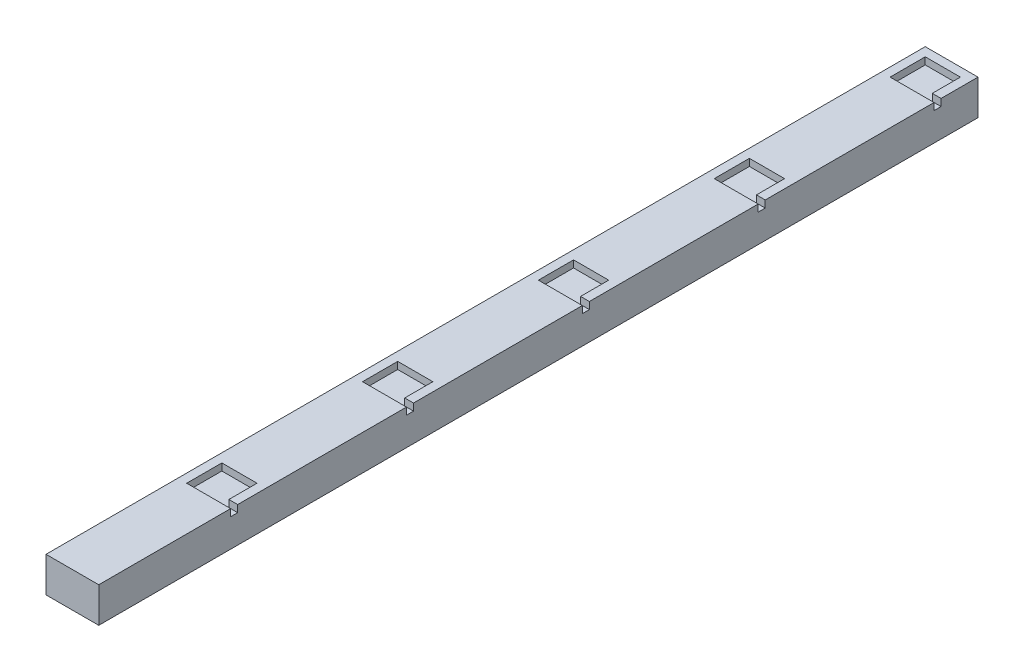
ISO-10303-21;
HEADER;
FILE_DESCRIPTION(('STEP AP214'),'2;1');
FILE_NAME('part.step','',(''),(''),'','','');
FILE_SCHEMA(('AUTOMOTIVE_DESIGN { 1 0 10303 214 1 1 1 1 }'));
ENDSEC;
DATA;
#1=APPLICATION_CONTEXT('core data for automotive mechanical design processes');
#2=APPLICATION_PROTOCOL_DEFINITION('international standard','automotive_design',2000,#1);
#3=PRODUCT_CONTEXT('',#1,'mechanical');
#4=PRODUCT('Part','Part','',(#3));
#5=PRODUCT_RELATED_PRODUCT_CATEGORY('part','',(#4));
#6=PRODUCT_DEFINITION_FORMATION('','',#4);
#7=PRODUCT_DEFINITION_CONTEXT('part definition',#1,'design');
#8=PRODUCT_DEFINITION('design','',#6,#7);
#9=PRODUCT_DEFINITION_SHAPE('','',#8);
#10=(LENGTH_UNIT() NAMED_UNIT(*) SI_UNIT(.MILLI.,.METRE.));
#11=(NAMED_UNIT(*) PLANE_ANGLE_UNIT() SI_UNIT($,.RADIAN.));
#12=(NAMED_UNIT(*) SI_UNIT($,.STERADIAN.) SOLID_ANGLE_UNIT());
#13=UNCERTAINTY_MEASURE_WITH_UNIT(LENGTH_MEASURE(1.E-05),#10,'distance_accuracy_value','');
#14=(GEOMETRIC_REPRESENTATION_CONTEXT(3) GLOBAL_UNCERTAINTY_ASSIGNED_CONTEXT((#13)) GLOBAL_UNIT_ASSIGNED_CONTEXT((#10,
#11,#12)) REPRESENTATION_CONTEXT('',''));
#15=CARTESIAN_POINT('',(0.,0.,0.));
#16=DIRECTION('',(0.,0.,1.));
#17=DIRECTION('',(1.,0.,0.));
#18=AXIS2_PLACEMENT_3D('',#15,#16,#17);
#19=CARTESIAN_POINT('',(0.,10.,-300.));
#20=DIRECTION('',(1.,0.,0.));
#21=DIRECTION('',(0.,0.,-1.));
#22=AXIS2_PLACEMENT_3D('',#19,#20,#21);
#23=PLANE('',#22);
#24=DIRECTION('',(0.,-1.,0.));
#25=VECTOR('',#24,1.);
#26=CARTESIAN_POINT('',(0.,10.,-50.));
#27=LINE('',#26,#25);
#28=CARTESIAN_POINT('',(0.,10.,-50.));
#29=VERTEX_POINT('',#28);
#30=CARTESIAN_POINT('',(0.,0.,-50.));
#31=VERTEX_POINT('',#30);
#32=EDGE_CURVE('E52',#29,#31,#27,.T.);
#33=ORIENTED_EDGE('',*,*,#32,.F.);
#34=DIRECTION('',(0.,0.,1.));
#35=VECTOR('',#34,1.);
#36=CARTESIAN_POINT('',(0.,10.,-300.));
#37=LINE('',#36,#35);
#38=CARTESIAN_POINT('',(0.,10.,-300.));
#39=VERTEX_POINT('',#38);
#40=EDGE_CURVE('E278',#39,#29,#37,.T.);
#41=ORIENTED_EDGE('',*,*,#40,.F.);
#42=DIRECTION('',(0.,-1.,0.));
#43=VECTOR('',#42,1.);
#44=CARTESIAN_POINT('',(0.,10.,-300.));
#45=LINE('',#44,#43);
#46=CARTESIAN_POINT('',(0.,0.,-300.));
#47=VERTEX_POINT('',#46);
#48=EDGE_CURVE('E46',#39,#47,#45,.T.);
#49=ORIENTED_EDGE('',*,*,#48,.T.);
#50=DIRECTION('',(0.,0.,1.));
#51=VECTOR('',#50,1.);
#52=CARTESIAN_POINT('',(0.,0.,-300.));
#53=LINE('',#52,#51);
#54=EDGE_CURVE('E279',#47,#31,#53,.T.);
#55=ORIENTED_EDGE('',*,*,#54,.T.);
#56=EDGE_LOOP('',(#33,#41,#49,#55));
#57=FACE_BOUND('',#56,.T.);
#58=ADVANCED_FACE('F39',(#57),#23,.F.);
#59=CARTESIAN_POINT('',(15.,10.,-300.));
#60=DIRECTION('',(-1.,0.,0.));
#61=DIRECTION('',(0.,0.,1.));
#62=AXIS2_PLACEMENT_3D('',#59,#60,#61);
#63=PLANE('',#62);
#64=DIRECTION('',(0.,1.,0.));
#65=VECTOR('',#64,1.);
#66=CARTESIAN_POINT('',(15.,10.,-50.));
#67=LINE('',#66,#65);
#68=CARTESIAN_POINT('',(15.,0.,-50.));
#69=VERTEX_POINT('',#68);
#70=CARTESIAN_POINT('',(15.,10.,-50.));
#71=VERTEX_POINT('',#70);
#72=EDGE_CURVE('E259',#69,#71,#67,.T.);
#73=ORIENTED_EDGE('',*,*,#72,.F.);
#74=DIRECTION('',(0.,0.,-1.));
#75=VECTOR('',#74,1.);
#76=CARTESIAN_POINT('',(15.,0.,-300.));
#77=LINE('',#76,#75);
#78=CARTESIAN_POINT('',(15.,0.,-300.));
#79=VERTEX_POINT('',#78);
#80=EDGE_CURVE('E269',#69,#79,#77,.T.);
#81=ORIENTED_EDGE('',*,*,#80,.T.);
#82=DIRECTION('',(0.,-1.,0.));
#83=VECTOR('',#82,1.);
#84=CARTESIAN_POINT('',(15.,10.,-300.));
#85=LINE('',#84,#83);
#86=CARTESIAN_POINT('',(15.,10.,-300.));
#87=VERTEX_POINT('',#86);
#88=EDGE_CURVE('E11',#87,#79,#85,.T.);
#89=ORIENTED_EDGE('',*,*,#88,.F.);
#90=DIRECTION('',(0.,0.,-1.));
#91=VECTOR('',#90,1.);
#92=CARTESIAN_POINT('',(15.,10.,-300.));
#93=LINE('',#92,#91);
#94=CARTESIAN_POINT('',(15.,10.,-289.5));
#95=VERTEX_POINT('',#94);
#96=EDGE_CURVE('E293',#95,#87,#93,.T.);
#97=ORIENTED_EDGE('',*,*,#96,.F.);
#98=DIRECTION('',(0.,1.,0.));
#99=VECTOR('',#98,1.);
#100=CARTESIAN_POINT('',(15.,8.,-289.5));
#101=LINE('',#100,#99);
#102=CARTESIAN_POINT('',(15.,8.,-289.5));
#103=VERTEX_POINT('',#102);
#104=EDGE_CURVE('E301',#103,#95,#101,.T.);
#105=ORIENTED_EDGE('',*,*,#104,.F.);
#106=DIRECTION('',(0.,0.,-1.));
#107=VECTOR('',#106,1.);
#108=CARTESIAN_POINT('',(15.,8.,-287.5));
#109=LINE('',#108,#107);
#110=CARTESIAN_POINT('',(15.,8.,-287.5));
#111=VERTEX_POINT('',#110);
#112=EDGE_CURVE('E336',#111,#103,#109,.T.);
#113=ORIENTED_EDGE('',*,*,#112,.F.);
#114=DIRECTION('',(0.,1.,0.));
#115=VECTOR('',#114,1.);
#116=CARTESIAN_POINT('',(15.,8.,-287.5));
#117=LINE('',#116,#115);
#118=CARTESIAN_POINT('',(15.,10.,-287.5));
#119=VERTEX_POINT('',#118);
#120=EDGE_CURVE('E299',#111,#119,#117,.T.);
#121=ORIENTED_EDGE('',*,*,#120,.T.);
#122=CARTESIAN_POINT('',(15.,10.,-239.5));
#123=VERTEX_POINT('',#122);
#124=EDGE_CURVE('E693',#123,#119,#93,.T.);
#125=ORIENTED_EDGE('',*,*,#124,.F.);
#126=DIRECTION('',(0.,1.,0.));
#127=VECTOR('',#126,1.);
#128=CARTESIAN_POINT('',(15.,8.,-239.5));
#129=LINE('',#128,#127);
#130=CARTESIAN_POINT('',(15.,8.,-239.5));
#131=VERTEX_POINT('',#130);
#132=EDGE_CURVE('E349',#131,#123,#129,.T.);
#133=ORIENTED_EDGE('',*,*,#132,.F.);
#134=DIRECTION('',(0.,0.,-1.));
#135=VECTOR('',#134,1.);
#136=CARTESIAN_POINT('',(15.,8.,-237.5));
#137=LINE('',#136,#135);
#138=CARTESIAN_POINT('',(15.,8.,-237.5));
#139=VERTEX_POINT('',#138);
#140=EDGE_CURVE('E381',#139,#131,#137,.T.);
#141=ORIENTED_EDGE('',*,*,#140,.F.);
#142=DIRECTION('',(0.,1.,0.));
#143=VECTOR('',#142,1.);
#144=CARTESIAN_POINT('',(15.,8.,-237.5));
#145=LINE('',#144,#143);
#146=CARTESIAN_POINT('',(15.,10.,-237.5));
#147=VERTEX_POINT('',#146);
#148=EDGE_CURVE('E343',#139,#147,#145,.T.);
#149=ORIENTED_EDGE('',*,*,#148,.T.);
#150=CARTESIAN_POINT('',(15.,10.,-189.5));
#151=VERTEX_POINT('',#150);
#152=EDGE_CURVE('E697',#151,#147,#93,.T.);
#153=ORIENTED_EDGE('',*,*,#152,.F.);
#154=DIRECTION('',(0.,1.,0.));
#155=VECTOR('',#154,1.);
#156=CARTESIAN_POINT('',(15.,8.,-189.5));
#157=LINE('',#156,#155);
#158=CARTESIAN_POINT('',(15.,8.,-189.5));
#159=VERTEX_POINT('',#158);
#160=EDGE_CURVE('E393',#159,#151,#157,.T.);
#161=ORIENTED_EDGE('',*,*,#160,.F.);
#162=DIRECTION('',(0.,0.,-1.));
#163=VECTOR('',#162,1.);
#164=CARTESIAN_POINT('',(15.,8.,-189.5));
#165=LINE('',#164,#163);
#166=CARTESIAN_POINT('',(15.,8.,-187.5));
#167=VERTEX_POINT('',#166);
#168=EDGE_CURVE('E426',#167,#159,#165,.T.);
#169=ORIENTED_EDGE('',*,*,#168,.F.);
#170=DIRECTION('',(0.,1.,0.));
#171=VECTOR('',#170,1.);
#172=CARTESIAN_POINT('',(15.,8.,-187.5));
#173=LINE('',#172,#171);
#174=CARTESIAN_POINT('',(15.,10.,-187.5));
#175=VERTEX_POINT('',#174);
#176=EDGE_CURVE('E388',#167,#175,#173,.T.);
#177=ORIENTED_EDGE('',*,*,#176,.T.);
#178=CARTESIAN_POINT('',(15.,10.,-139.5));
#179=VERTEX_POINT('',#178);
#180=EDGE_CURVE('E705',#179,#175,#93,.T.);
#181=ORIENTED_EDGE('',*,*,#180,.F.);
#182=DIRECTION('',(0.,1.,0.));
#183=VECTOR('',#182,1.);
#184=CARTESIAN_POINT('',(15.,8.,-139.5));
#185=LINE('',#184,#183);
#186=CARTESIAN_POINT('',(15.,8.,-139.5));
#187=VERTEX_POINT('',#186);
#188=EDGE_CURVE('E438',#187,#179,#185,.T.);
#189=ORIENTED_EDGE('',*,*,#188,.F.);
#190=DIRECTION('',(0.,0.,-1.));
#191=VECTOR('',#190,1.);
#192=CARTESIAN_POINT('',(15.,8.,-139.5));
#193=LINE('',#192,#191);
#194=CARTESIAN_POINT('',(15.,8.,-137.5));
#195=VERTEX_POINT('',#194);
#196=EDGE_CURVE('E473',#195,#187,#193,.T.);
#197=ORIENTED_EDGE('',*,*,#196,.F.);
#198=DIRECTION('',(0.,1.,0.));
#199=VECTOR('',#198,1.);
#200=CARTESIAN_POINT('',(15.,8.,-137.5));
#201=LINE('',#200,#199);
#202=CARTESIAN_POINT('',(15.,10.,-137.5));
#203=VERTEX_POINT('',#202);
#204=EDGE_CURVE('E434',#195,#203,#201,.T.);
#205=ORIENTED_EDGE('',*,*,#204,.T.);
#206=CARTESIAN_POINT('',(15.,10.,-89.5));
#207=VERTEX_POINT('',#206);
#208=EDGE_CURVE('E291',#207,#203,#93,.T.);
#209=ORIENTED_EDGE('',*,*,#208,.F.);
#210=DIRECTION('',(0.,1.,0.));
#211=VECTOR('',#210,1.);
#212=CARTESIAN_POINT('',(15.,8.,-89.5));
#213=LINE('',#212,#211);
#214=CARTESIAN_POINT('',(15.,8.,-89.5));
#215=VERTEX_POINT('',#214);
#216=EDGE_CURVE('E483',#215,#207,#213,.T.);
#217=ORIENTED_EDGE('',*,*,#216,.F.);
#218=DIRECTION('',(0.,0.,-1.));
#219=VECTOR('',#218,1.);
#220=CARTESIAN_POINT('',(15.,8.,-89.5));
#221=LINE('',#220,#219);
#222=CARTESIAN_POINT('',(15.,8.,-87.5));
#223=VERTEX_POINT('',#222);
#224=EDGE_CURVE('E515',#223,#215,#221,.T.);
#225=ORIENTED_EDGE('',*,*,#224,.F.);
#226=DIRECTION('',(0.,1.,0.));
#227=VECTOR('',#226,1.);
#228=CARTESIAN_POINT('',(15.,8.,-87.5));
#229=LINE('',#228,#227);
#230=CARTESIAN_POINT('',(15.,10.,-87.5));
#231=VERTEX_POINT('',#230);
#232=EDGE_CURVE('E477',#223,#231,#229,.T.);
#233=ORIENTED_EDGE('',*,*,#232,.T.);
#234=EDGE_CURVE('E275',#71,#231,#93,.T.);
#235=ORIENTED_EDGE('',*,*,#234,.F.);
#236=EDGE_LOOP('',(#73,#81,#89,#97,#105,#113,#121,#125,#133,#141,#149,#153,#161,#169,#177,#181,
#189,#197,#205,#209,#217,#225,#233,#235));
#237=FACE_BOUND('',#236,.T.);
#238=ADVANCED_FACE('F268',(#237),#63,.F.);
#239=CARTESIAN_POINT('',(0.,0.,0.));
#240=DIRECTION('',(0.,1.,0.));
#241=DIRECTION('',(0.,0.,1.));
#242=AXIS2_PLACEMENT_3D('',#239,#240,#241);
#243=PLANE('',#242);
#244=DIRECTION('',(1.,0.,0.));
#245=VECTOR('',#244,1.);
#246=CARTESIAN_POINT('',(0.,0.,-50.));
#247=LINE('',#246,#245);
#248=EDGE_CURVE('E258',#31,#69,#247,.T.);
#249=ORIENTED_EDGE('',*,*,#248,.F.);
#250=ORIENTED_EDGE('',*,*,#54,.F.);
#251=DIRECTION('',(-1.,0.,0.));
#252=VECTOR('',#251,1.);
#253=CARTESIAN_POINT('',(0.,0.,-300.));
#254=LINE('',#253,#252);
#255=EDGE_CURVE('E280',#79,#47,#254,.T.);
#256=ORIENTED_EDGE('',*,*,#255,.F.);
#257=ORIENTED_EDGE('',*,*,#80,.F.);
#258=EDGE_LOOP('',(#249,#250,#256,#257));
#259=FACE_BOUND('',#258,.T.);
#260=ADVANCED_FACE('F277',(#259),#243,.F.);
#261=CARTESIAN_POINT('',(0.,10.,-300.));
#262=DIRECTION('',(0.,0.,1.));
#263=DIRECTION('',(1.,0.,0.));
#264=AXIS2_PLACEMENT_3D('',#261,#262,#263);
#265=PLANE('',#264);
#266=ORIENTED_EDGE('',*,*,#255,.T.);
#267=ORIENTED_EDGE('',*,*,#48,.F.);
#268=DIRECTION('',(-1.,0.,0.));
#269=VECTOR('',#268,1.);
#270=CARTESIAN_POINT('',(0.,10.,-300.));
#271=LINE('',#270,#269);
#272=EDGE_CURVE('E287',#87,#39,#271,.T.);
#273=ORIENTED_EDGE('',*,*,#272,.F.);
#274=ORIENTED_EDGE('',*,*,#88,.T.);
#275=EDGE_LOOP('',(#266,#267,#273,#274));
#276=FACE_BOUND('',#275,.T.);
#277=ADVANCED_FACE('F524',(#276),#265,.F.);
#278=CARTESIAN_POINT('',(0.,10.,0.));
#279=DIRECTION('',(0.,1.,0.));
#280=DIRECTION('',(0.,0.,1.));
#281=AXIS2_PLACEMENT_3D('',#278,#279,#280);
#282=PLANE('',#281);
#283=DIRECTION('',(-1.,0.,0.));
#284=VECTOR('',#283,1.);
#285=CARTESIAN_POINT('',(0.,10.,-50.));
#286=LINE('',#285,#284);
#287=EDGE_CURVE('E272',#71,#29,#286,.T.);
#288=ORIENTED_EDGE('',*,*,#287,.F.);
#289=ORIENTED_EDGE('',*,*,#234,.T.);
#290=DIRECTION('',(1.,0.,0.));
#291=VECTOR('',#290,1.);
#292=CARTESIAN_POINT('',(12.5,10.,-87.5));
#293=LINE('',#292,#291);
#294=CARTESIAN_POINT('',(2.5,10.,-87.5));
#295=VERTEX_POINT('',#294);
#296=EDGE_CURVE('E499',#295,#231,#293,.T.);
#297=ORIENTED_EDGE('',*,*,#296,.F.);
#298=DIRECTION('',(0.,0.,1.));
#299=VECTOR('',#298,1.);
#300=CARTESIAN_POINT('',(2.5,10.,-97.5));
#301=LINE('',#300,#299);
#302=CARTESIAN_POINT('',(2.5,10.,-97.5));
#303=VERTEX_POINT('',#302);
#304=EDGE_CURVE('E501',#303,#295,#301,.T.);
#305=ORIENTED_EDGE('',*,*,#304,.F.);
#306=DIRECTION('',(-1.,0.,0.));
#307=VECTOR('',#306,1.);
#308=CARTESIAN_POINT('',(2.5,10.,-97.5));
#309=LINE('',#308,#307);
#310=CARTESIAN_POINT('',(12.5,10.,-97.5));
#311=VERTEX_POINT('',#310);
#312=EDGE_CURVE('E489',#311,#303,#309,.T.);
#313=ORIENTED_EDGE('',*,*,#312,.F.);
#314=DIRECTION('',(0.,0.,-1.));
#315=VECTOR('',#314,1.);
#316=CARTESIAN_POINT('',(12.5,10.,-89.5));
#317=LINE('',#316,#315);
#318=CARTESIAN_POINT('',(12.5,10.,-89.5));
#319=VERTEX_POINT('',#318);
#320=EDGE_CURVE('E493',#319,#311,#317,.T.);
#321=ORIENTED_EDGE('',*,*,#320,.F.);
#322=DIRECTION('',(-1.,0.,0.));
#323=VECTOR('',#322,1.);
#324=CARTESIAN_POINT('',(12.5,10.,-89.5));
#325=LINE('',#324,#323);
#326=EDGE_CURVE('E61',#207,#319,#325,.T.);
#327=ORIENTED_EDGE('',*,*,#326,.F.);
#328=ORIENTED_EDGE('',*,*,#208,.T.);
#329=DIRECTION('',(1.,0.,0.));
#330=VECTOR('',#329,1.);
#331=CARTESIAN_POINT('',(12.5,10.,-137.5));
#332=LINE('',#331,#330);
#333=CARTESIAN_POINT('',(2.5,10.,-137.5));
#334=VERTEX_POINT('',#333);
#335=EDGE_CURVE('E457',#334,#203,#332,.T.);
#336=ORIENTED_EDGE('',*,*,#335,.F.);
#337=DIRECTION('',(0.,0.,1.));
#338=VECTOR('',#337,1.);
#339=CARTESIAN_POINT('',(2.5,10.,-147.5));
#340=LINE('',#339,#338);
#341=CARTESIAN_POINT('',(2.5,10.,-147.5));
#342=VERTEX_POINT('',#341);
#343=EDGE_CURVE('E459',#342,#334,#340,.T.);
#344=ORIENTED_EDGE('',*,*,#343,.F.);
#345=DIRECTION('',(-1.,0.,0.));
#346=VECTOR('',#345,1.);
#347=CARTESIAN_POINT('',(2.5,10.,-147.5));
#348=LINE('',#347,#346);
#349=CARTESIAN_POINT('',(12.5,10.,-147.5));
#350=VERTEX_POINT('',#349);
#351=EDGE_CURVE('E450',#350,#342,#348,.T.);
#352=ORIENTED_EDGE('',*,*,#351,.F.);
#353=DIRECTION('',(0.,0.,-1.));
#354=VECTOR('',#353,1.);
#355=CARTESIAN_POINT('',(12.5,10.,-139.5));
#356=LINE('',#355,#354);
#357=CARTESIAN_POINT('',(12.5,10.,-139.5));
#358=VERTEX_POINT('',#357);
#359=EDGE_CURVE('E452',#358,#350,#356,.T.);
#360=ORIENTED_EDGE('',*,*,#359,.F.);
#361=DIRECTION('',(-1.,0.,0.));
#362=VECTOR('',#361,1.);
#363=CARTESIAN_POINT('',(12.5,10.,-139.5));
#364=LINE('',#363,#362);
#365=EDGE_CURVE('E451',#179,#358,#364,.T.);
#366=ORIENTED_EDGE('',*,*,#365,.F.);
#367=ORIENTED_EDGE('',*,*,#180,.T.);
#368=DIRECTION('',(1.,0.,0.));
#369=VECTOR('',#368,1.);
#370=CARTESIAN_POINT('',(12.5,10.,-187.5));
#371=LINE('',#370,#369);
#372=CARTESIAN_POINT('',(2.5,10.,-187.5));
#373=VERTEX_POINT('',#372);
#374=EDGE_CURVE('E412',#373,#175,#371,.T.);
#375=ORIENTED_EDGE('',*,*,#374,.F.);
#376=DIRECTION('',(0.,0.,1.));
#377=VECTOR('',#376,1.);
#378=CARTESIAN_POINT('',(2.5,10.,-197.5));
#379=LINE('',#378,#377);
#380=CARTESIAN_POINT('',(2.5,10.,-197.5));
#381=VERTEX_POINT('',#380);
#382=EDGE_CURVE('E411',#381,#373,#379,.T.);
#383=ORIENTED_EDGE('',*,*,#382,.F.);
#384=DIRECTION('',(-1.,0.,0.));
#385=VECTOR('',#384,1.);
#386=CARTESIAN_POINT('',(2.5,10.,-197.5));
#387=LINE('',#386,#385);
#388=CARTESIAN_POINT('',(12.5,10.,-197.5));
#389=VERTEX_POINT('',#388);
#390=EDGE_CURVE('E405',#389,#381,#387,.T.);
#391=ORIENTED_EDGE('',*,*,#390,.F.);
#392=DIRECTION('',(0.,0.,-1.));
#393=VECTOR('',#392,1.);
#394=CARTESIAN_POINT('',(12.5,10.,-197.5));
#395=LINE('',#394,#393);
#396=CARTESIAN_POINT('',(12.5,10.,-189.5));
#397=VERTEX_POINT('',#396);
#398=EDGE_CURVE('E406',#397,#389,#395,.T.);
#399=ORIENTED_EDGE('',*,*,#398,.F.);
#400=DIRECTION('',(-1.,0.,0.));
#401=VECTOR('',#400,1.);
#402=CARTESIAN_POINT('',(12.5,10.,-189.5));
#403=LINE('',#402,#401);
#404=EDGE_CURVE('E408',#151,#397,#403,.T.);
#405=ORIENTED_EDGE('',*,*,#404,.F.);
#406=ORIENTED_EDGE('',*,*,#152,.T.);
#407=DIRECTION('',(1.,0.,0.));
#408=VECTOR('',#407,1.);
#409=CARTESIAN_POINT('',(12.5,10.,-237.5));
#410=LINE('',#409,#408);
#411=CARTESIAN_POINT('',(2.5,10.,-237.5));
#412=VERTEX_POINT('',#411);
#413=EDGE_CURVE('E368',#412,#147,#410,.T.);
#414=ORIENTED_EDGE('',*,*,#413,.F.);
#415=DIRECTION('',(0.,0.,1.));
#416=VECTOR('',#415,1.);
#417=CARTESIAN_POINT('',(2.5,10.,-247.5));
#418=LINE('',#417,#416);
#419=CARTESIAN_POINT('',(2.5,10.,-247.5));
#420=VERTEX_POINT('',#419);
#421=EDGE_CURVE('E369',#420,#412,#418,.T.);
#422=ORIENTED_EDGE('',*,*,#421,.F.);
#423=DIRECTION('',(-1.,0.,0.));
#424=VECTOR('',#423,1.);
#425=CARTESIAN_POINT('',(2.5,10.,-247.5));
#426=LINE('',#425,#424);
#427=CARTESIAN_POINT('',(12.5,10.,-247.5));
#428=VERTEX_POINT('',#427);
#429=EDGE_CURVE('E360',#428,#420,#426,.T.);
#430=ORIENTED_EDGE('',*,*,#429,.F.);
#431=DIRECTION('',(0.,0.,-1.));
#432=VECTOR('',#431,1.);
#433=CARTESIAN_POINT('',(12.5,10.,-247.5));
#434=LINE('',#433,#432);
#435=CARTESIAN_POINT('',(12.5,10.,-239.5));
#436=VERTEX_POINT('',#435);
#437=EDGE_CURVE('E363',#436,#428,#434,.T.);
#438=ORIENTED_EDGE('',*,*,#437,.F.);
#439=DIRECTION('',(-1.,0.,0.));
#440=VECTOR('',#439,1.);
#441=CARTESIAN_POINT('',(12.5,10.,-239.5));
#442=LINE('',#441,#440);
#443=EDGE_CURVE('E365',#123,#436,#442,.T.);
#444=ORIENTED_EDGE('',*,*,#443,.F.);
#445=ORIENTED_EDGE('',*,*,#124,.T.);
#446=DIRECTION('',(1.,0.,0.));
#447=VECTOR('',#446,1.);
#448=CARTESIAN_POINT('',(12.5,10.,-287.5));
#449=LINE('',#448,#447);
#450=CARTESIAN_POINT('',(2.5,10.,-287.5));
#451=VERTEX_POINT('',#450);
#452=EDGE_CURVE('E321',#451,#119,#449,.T.);
#453=ORIENTED_EDGE('',*,*,#452,.F.);
#454=DIRECTION('',(0.,0.,1.));
#455=VECTOR('',#454,1.);
#456=CARTESIAN_POINT('',(2.5,10.,-297.5));
#457=LINE('',#456,#455);
#458=CARTESIAN_POINT('',(2.5,10.,-297.5));
#459=VERTEX_POINT('',#458);
#460=EDGE_CURVE('E322',#459,#451,#457,.T.);
#461=ORIENTED_EDGE('',*,*,#460,.F.);
#462=DIRECTION('',(-1.,0.,0.));
#463=VECTOR('',#462,1.);
#464=CARTESIAN_POINT('',(2.5,10.,-297.5));
#465=LINE('',#464,#463);
#466=CARTESIAN_POINT('',(12.5,10.,-297.5));
#467=VERTEX_POINT('',#466);
#468=EDGE_CURVE('E315',#467,#459,#465,.T.);
#469=ORIENTED_EDGE('',*,*,#468,.F.);
#470=DIRECTION('',(0.,0.,-1.));
#471=VECTOR('',#470,1.);
#472=CARTESIAN_POINT('',(12.5,10.,-297.5));
#473=LINE('',#472,#471);
#474=CARTESIAN_POINT('',(12.5,10.,-289.5));
#475=VERTEX_POINT('',#474);
#476=EDGE_CURVE('E316',#475,#467,#473,.T.);
#477=ORIENTED_EDGE('',*,*,#476,.F.);
#478=DIRECTION('',(-1.,0.,0.));
#479=VECTOR('',#478,1.);
#480=CARTESIAN_POINT('',(12.5,10.,-289.5));
#481=LINE('',#480,#479);
#482=EDGE_CURVE('E317',#95,#475,#481,.T.);
#483=ORIENTED_EDGE('',*,*,#482,.F.);
#484=ORIENTED_EDGE('',*,*,#96,.T.);
#485=ORIENTED_EDGE('',*,*,#272,.T.);
#486=ORIENTED_EDGE('',*,*,#40,.T.);
#487=EDGE_LOOP('',(#288,#289,#297,#305,#313,#321,#327,#328,#336,#344,#352,#360,#366,#367,#375,
#383,#391,#399,#405,#406,#414,#422,#430,#438,#444,#445,#453,#461,#469,#477,#483,#484,#485,#486));
#488=FACE_BOUND('',#487,.T.);
#489=ADVANCED_FACE('F519',(#488),#282,.T.);
#490=CARTESIAN_POINT('',(2.5,8.,-297.5));
#491=DIRECTION('',(-1.,0.,0.));
#492=DIRECTION('',(0.,0.,1.));
#493=AXIS2_PLACEMENT_3D('',#490,#491,#492);
#494=PLANE('',#493);
#495=ORIENTED_EDGE('',*,*,#460,.T.);
#496=DIRECTION('',(0.,1.,0.));
#497=VECTOR('',#496,1.);
#498=CARTESIAN_POINT('',(2.5,8.,-287.5));
#499=LINE('',#498,#497);
#500=CARTESIAN_POINT('',(2.5,8.,-287.5));
#501=VERTEX_POINT('',#500);
#502=EDGE_CURVE('E297',#501,#451,#499,.T.);
#503=ORIENTED_EDGE('',*,*,#502,.F.);
#504=DIRECTION('',(0.,0.,1.));
#505=VECTOR('',#504,1.);
#506=CARTESIAN_POINT('',(2.5,8.,-297.5));
#507=LINE('',#506,#505);
#508=CARTESIAN_POINT('',(2.5,8.,-297.5));
#509=VERTEX_POINT('',#508);
#510=EDGE_CURVE('E312',#509,#501,#507,.T.);
#511=ORIENTED_EDGE('',*,*,#510,.F.);
#512=DIRECTION('',(0.,1.,0.));
#513=VECTOR('',#512,1.);
#514=CARTESIAN_POINT('',(2.5,8.,-297.5));
#515=LINE('',#514,#513);
#516=EDGE_CURVE('E285',#509,#459,#515,.T.);
#517=ORIENTED_EDGE('',*,*,#516,.T.);
#518=EDGE_LOOP('',(#495,#503,#511,#517));
#519=FACE_BOUND('',#518,.T.);
#520=ADVANCED_FACE('F525',(#519),#494,.F.);
#521=CARTESIAN_POINT('',(2.5,8.,-297.5));
#522=DIRECTION('',(0.,0.,-1.));
#523=DIRECTION('',(-1.,0.,0.));
#524=AXIS2_PLACEMENT_3D('',#521,#522,#523);
#525=PLANE('',#524);
#526=ORIENTED_EDGE('',*,*,#468,.T.);
#527=ORIENTED_EDGE('',*,*,#516,.F.);
#528=DIRECTION('',(-1.,0.,0.));
#529=VECTOR('',#528,1.);
#530=CARTESIAN_POINT('',(2.5,8.,-297.5));
#531=LINE('',#530,#529);
#532=CARTESIAN_POINT('',(12.5,8.,-297.5));
#533=VERTEX_POINT('',#532);
#534=EDGE_CURVE('E302',#533,#509,#531,.T.);
#535=ORIENTED_EDGE('',*,*,#534,.F.);
#536=DIRECTION('',(0.,1.,0.));
#537=VECTOR('',#536,1.);
#538=CARTESIAN_POINT('',(12.5,8.,-297.5));
#539=LINE('',#538,#537);
#540=EDGE_CURVE('E310',#533,#467,#539,.T.);
#541=ORIENTED_EDGE('',*,*,#540,.T.);
#542=EDGE_LOOP('',(#526,#527,#535,#541));
#543=FACE_BOUND('',#542,.T.);
#544=ADVANCED_FACE('F529',(#543),#525,.F.);
#545=CARTESIAN_POINT('',(12.5,8.,-297.5));
#546=DIRECTION('',(1.,0.,0.));
#547=DIRECTION('',(0.,0.,-1.));
#548=AXIS2_PLACEMENT_3D('',#545,#546,#547);
#549=PLANE('',#548);
#550=ORIENTED_EDGE('',*,*,#476,.T.);
#551=ORIENTED_EDGE('',*,*,#540,.F.);
#552=DIRECTION('',(0.,0.,-1.));
#553=VECTOR('',#552,1.);
#554=CARTESIAN_POINT('',(12.5,8.,-297.5));
#555=LINE('',#554,#553);
#556=CARTESIAN_POINT('',(12.5,8.,-289.5));
#557=VERTEX_POINT('',#556);
#558=EDGE_CURVE('E329',#557,#533,#555,.T.);
#559=ORIENTED_EDGE('',*,*,#558,.F.);
#560=DIRECTION('',(0.,1.,0.));
#561=VECTOR('',#560,1.);
#562=CARTESIAN_POINT('',(12.5,8.,-289.5));
#563=LINE('',#562,#561);
#564=EDGE_CURVE('E308',#557,#475,#563,.T.);
#565=ORIENTED_EDGE('',*,*,#564,.T.);
#566=EDGE_LOOP('',(#550,#551,#559,#565));
#567=FACE_BOUND('',#566,.T.);
#568=ADVANCED_FACE('F672',(#567),#549,.F.);
#569=CARTESIAN_POINT('',(12.5,8.,-289.5));
#570=DIRECTION('',(0.,0.,-1.));
#571=DIRECTION('',(-1.,0.,0.));
#572=AXIS2_PLACEMENT_3D('',#569,#570,#571);
#573=PLANE('',#572);
#574=ORIENTED_EDGE('',*,*,#482,.T.);
#575=ORIENTED_EDGE('',*,*,#564,.F.);
#576=DIRECTION('',(-1.,0.,0.));
#577=VECTOR('',#576,1.);
#578=CARTESIAN_POINT('',(12.5,8.,-289.5));
#579=LINE('',#578,#577);
#580=EDGE_CURVE('E334',#103,#557,#579,.T.);
#581=ORIENTED_EDGE('',*,*,#580,.F.);
#582=ORIENTED_EDGE('',*,*,#104,.T.);
#583=EDGE_LOOP('',(#574,#575,#581,#582));
#584=FACE_BOUND('',#583,.T.);
#585=ADVANCED_FACE('F673',(#584),#573,.F.);
#586=CARTESIAN_POINT('',(12.5,8.,-287.5));
#587=DIRECTION('',(0.,0.,1.));
#588=DIRECTION('',(1.,0.,0.));
#589=AXIS2_PLACEMENT_3D('',#586,#587,#588);
#590=PLANE('',#589);
#591=ORIENTED_EDGE('',*,*,#452,.T.);
#592=ORIENTED_EDGE('',*,*,#120,.F.);
#593=DIRECTION('',(1.,0.,0.));
#594=VECTOR('',#593,1.);
#595=CARTESIAN_POINT('',(2.5,8.,-287.5));
#596=LINE('',#595,#594);
#597=EDGE_CURVE('E338',#501,#111,#596,.T.);
#598=ORIENTED_EDGE('',*,*,#597,.F.);
#599=ORIENTED_EDGE('',*,*,#502,.T.);
#600=EDGE_LOOP('',(#591,#592,#598,#599));
#601=FACE_BOUND('',#600,.T.);
#602=ADVANCED_FACE('F670',(#601),#590,.F.);
#603=CARTESIAN_POINT('',(0.,8.,0.));
#604=DIRECTION('',(0.,1.,0.));
#605=DIRECTION('',(0.,0.,1.));
#606=AXIS2_PLACEMENT_3D('',#603,#604,#605);
#607=PLANE('',#606);
#608=ORIENTED_EDGE('',*,*,#510,.T.);
#609=ORIENTED_EDGE('',*,*,#597,.T.);
#610=ORIENTED_EDGE('',*,*,#112,.T.);
#611=ORIENTED_EDGE('',*,*,#580,.T.);
#612=ORIENTED_EDGE('',*,*,#558,.T.);
#613=ORIENTED_EDGE('',*,*,#534,.T.);
#614=EDGE_LOOP('',(#608,#609,#610,#611,#612,#613));
#615=FACE_BOUND('',#614,.T.);
#616=ADVANCED_FACE('F664',(#615),#607,.T.);
#617=CARTESIAN_POINT('',(2.5,8.,-247.5));
#618=DIRECTION('',(-1.,0.,0.));
#619=DIRECTION('',(0.,0.,1.));
#620=AXIS2_PLACEMENT_3D('',#617,#618,#619);
#621=PLANE('',#620);
#622=ORIENTED_EDGE('',*,*,#421,.T.);
#623=DIRECTION('',(0.,1.,0.));
#624=VECTOR('',#623,1.);
#625=CARTESIAN_POINT('',(2.5,8.,-237.5));
#626=LINE('',#625,#624);
#627=CARTESIAN_POINT('',(2.5,8.,-237.5));
#628=VERTEX_POINT('',#627);
#629=EDGE_CURVE('E344',#628,#412,#626,.T.);
#630=ORIENTED_EDGE('',*,*,#629,.F.);
#631=DIRECTION('',(0.,0.,1.));
#632=VECTOR('',#631,1.);
#633=CARTESIAN_POINT('',(2.5,8.,-247.5));
#634=LINE('',#633,#632);
#635=CARTESIAN_POINT('',(2.5,8.,-247.5));
#636=VERTEX_POINT('',#635);
#637=EDGE_CURVE('E358',#636,#628,#634,.T.);
#638=ORIENTED_EDGE('',*,*,#637,.F.);
#639=DIRECTION('',(0.,1.,0.));
#640=VECTOR('',#639,1.);
#641=CARTESIAN_POINT('',(2.5,8.,-247.5));
#642=LINE('',#641,#640);
#643=EDGE_CURVE('E330',#636,#420,#642,.T.);
#644=ORIENTED_EDGE('',*,*,#643,.T.);
#645=EDGE_LOOP('',(#622,#630,#638,#644));
#646=FACE_BOUND('',#645,.T.);
#647=ADVANCED_FACE('F647',(#646),#621,.F.);
#648=CARTESIAN_POINT('',(2.5,8.,-247.5));
#649=DIRECTION('',(0.,0.,-1.));
#650=DIRECTION('',(-1.,0.,0.));
#651=AXIS2_PLACEMENT_3D('',#648,#649,#650);
#652=PLANE('',#651);
#653=ORIENTED_EDGE('',*,*,#429,.T.);
#654=ORIENTED_EDGE('',*,*,#643,.F.);
#655=DIRECTION('',(-1.,0.,0.));
#656=VECTOR('',#655,1.);
#657=CARTESIAN_POINT('',(2.5,8.,-247.5));
#658=LINE('',#657,#656);
#659=CARTESIAN_POINT('',(12.5,8.,-247.5));
#660=VERTEX_POINT('',#659);
#661=EDGE_CURVE('E347',#660,#636,#658,.T.);
#662=ORIENTED_EDGE('',*,*,#661,.F.);
#663=DIRECTION('',(0.,1.,0.));
#664=VECTOR('',#663,1.);
#665=CARTESIAN_POINT('',(12.5,8.,-247.5));
#666=LINE('',#665,#664);
#667=EDGE_CURVE('E353',#660,#428,#666,.T.);
#668=ORIENTED_EDGE('',*,*,#667,.T.);
#669=EDGE_LOOP('',(#653,#654,#662,#668));
#670=FACE_BOUND('',#669,.T.);
#671=ADVANCED_FACE('F642',(#670),#652,.F.);
#672=CARTESIAN_POINT('',(12.5,8.,-247.5));
#673=DIRECTION('',(1.,0.,0.));
#674=DIRECTION('',(0.,0.,-1.));
#675=AXIS2_PLACEMENT_3D('',#672,#673,#674);
#676=PLANE('',#675);
#677=ORIENTED_EDGE('',*,*,#437,.T.);
#678=ORIENTED_EDGE('',*,*,#667,.F.);
#679=DIRECTION('',(0.,0.,-1.));
#680=VECTOR('',#679,1.);
#681=CARTESIAN_POINT('',(12.5,8.,-247.5));
#682=LINE('',#681,#680);
#683=CARTESIAN_POINT('',(12.5,8.,-239.5));
#684=VERTEX_POINT('',#683);
#685=EDGE_CURVE('E374',#684,#660,#682,.T.);
#686=ORIENTED_EDGE('',*,*,#685,.F.);
#687=DIRECTION('',(0.,1.,0.));
#688=VECTOR('',#687,1.);
#689=CARTESIAN_POINT('',(12.5,8.,-239.5));
#690=LINE('',#689,#688);
#691=EDGE_CURVE('E351',#684,#436,#690,.T.);
#692=ORIENTED_EDGE('',*,*,#691,.T.);
#693=EDGE_LOOP('',(#677,#678,#686,#692));
#694=FACE_BOUND('',#693,.T.);
#695=ADVANCED_FACE('F648',(#694),#676,.F.);
#696=CARTESIAN_POINT('',(12.5,8.,-239.5));
#697=DIRECTION('',(0.,0.,-1.));
#698=DIRECTION('',(-1.,0.,0.));
#699=AXIS2_PLACEMENT_3D('',#696,#697,#698);
#700=PLANE('',#699);
#701=ORIENTED_EDGE('',*,*,#443,.T.);
#702=ORIENTED_EDGE('',*,*,#691,.F.);
#703=DIRECTION('',(-1.,0.,0.));
#704=VECTOR('',#703,1.);
#705=CARTESIAN_POINT('',(12.5,8.,-239.5));
#706=LINE('',#705,#704);
#707=EDGE_CURVE('E378',#131,#684,#706,.T.);
#708=ORIENTED_EDGE('',*,*,#707,.F.);
#709=ORIENTED_EDGE('',*,*,#132,.T.);
#710=EDGE_LOOP('',(#701,#702,#708,#709));
#711=FACE_BOUND('',#710,.T.);
#712=ADVANCED_FACE('F653',(#711),#700,.F.);
#713=CARTESIAN_POINT('',(12.5,8.,-237.5));
#714=DIRECTION('',(0.,0.,1.));
#715=DIRECTION('',(1.,0.,0.));
#716=AXIS2_PLACEMENT_3D('',#713,#714,#715);
#717=PLANE('',#716);
#718=ORIENTED_EDGE('',*,*,#413,.T.);
#719=ORIENTED_EDGE('',*,*,#148,.F.);
#720=DIRECTION('',(1.,0.,0.));
#721=VECTOR('',#720,1.);
#722=CARTESIAN_POINT('',(2.5,8.,-237.5));
#723=LINE('',#722,#721);
#724=EDGE_CURVE('E383',#628,#139,#723,.T.);
#725=ORIENTED_EDGE('',*,*,#724,.F.);
#726=ORIENTED_EDGE('',*,*,#629,.T.);
#727=EDGE_LOOP('',(#718,#719,#725,#726));
#728=FACE_BOUND('',#727,.T.);
#729=ADVANCED_FACE('F641',(#728),#717,.F.);
#730=CARTESIAN_POINT('',(0.,8.,0.));
#731=DIRECTION('',(0.,1.,0.));
#732=DIRECTION('',(0.,0.,1.));
#733=AXIS2_PLACEMENT_3D('',#730,#731,#732);
#734=PLANE('',#733);
#735=ORIENTED_EDGE('',*,*,#637,.T.);
#736=ORIENTED_EDGE('',*,*,#724,.T.);
#737=ORIENTED_EDGE('',*,*,#140,.T.);
#738=ORIENTED_EDGE('',*,*,#707,.T.);
#739=ORIENTED_EDGE('',*,*,#685,.T.);
#740=ORIENTED_EDGE('',*,*,#661,.T.);
#741=EDGE_LOOP('',(#735,#736,#737,#738,#739,#740));
#742=FACE_BOUND('',#741,.T.);
#743=ADVANCED_FACE('F640',(#742),#734,.T.);
#744=CARTESIAN_POINT('',(2.5,8.,-197.5));
#745=DIRECTION('',(-1.,0.,0.));
#746=DIRECTION('',(0.,0.,1.));
#747=AXIS2_PLACEMENT_3D('',#744,#745,#746);
#748=PLANE('',#747);
#749=ORIENTED_EDGE('',*,*,#382,.T.);
#750=DIRECTION('',(0.,1.,0.));
#751=VECTOR('',#750,1.);
#752=CARTESIAN_POINT('',(2.5,8.,-187.5));
#753=LINE('',#752,#751);
#754=CARTESIAN_POINT('',(2.5,8.,-187.5));
#755=VERTEX_POINT('',#754);
#756=EDGE_CURVE('E389',#755,#373,#753,.T.);
#757=ORIENTED_EDGE('',*,*,#756,.F.);
#758=DIRECTION('',(0.,0.,1.));
#759=VECTOR('',#758,1.);
#760=CARTESIAN_POINT('',(2.5,8.,-197.5));
#761=LINE('',#760,#759);
#762=CARTESIAN_POINT('',(2.5,8.,-197.5));
#763=VERTEX_POINT('',#762);
#764=EDGE_CURVE('E403',#763,#755,#761,.T.);
#765=ORIENTED_EDGE('',*,*,#764,.F.);
#766=DIRECTION('',(0.,1.,0.));
#767=VECTOR('',#766,1.);
#768=CARTESIAN_POINT('',(2.5,8.,-197.5));
#769=LINE('',#768,#767);
#770=EDGE_CURVE('E375',#763,#381,#769,.T.);
#771=ORIENTED_EDGE('',*,*,#770,.T.);
#772=EDGE_LOOP('',(#749,#757,#765,#771));
#773=FACE_BOUND('',#772,.T.);
#774=ADVANCED_FACE('F623',(#773),#748,.F.);
#775=CARTESIAN_POINT('',(2.5,8.,-197.5));
#776=DIRECTION('',(0.,0.,-1.));
#777=DIRECTION('',(-1.,0.,0.));
#778=AXIS2_PLACEMENT_3D('',#775,#776,#777);
#779=PLANE('',#778);
#780=ORIENTED_EDGE('',*,*,#390,.T.);
#781=ORIENTED_EDGE('',*,*,#770,.F.);
#782=DIRECTION('',(-1.,0.,0.));
#783=VECTOR('',#782,1.);
#784=CARTESIAN_POINT('',(2.5,8.,-197.5));
#785=LINE('',#784,#783);
#786=CARTESIAN_POINT('',(12.5,8.,-197.5));
#787=VERTEX_POINT('',#786);
#788=EDGE_CURVE('E391',#787,#763,#785,.T.);
#789=ORIENTED_EDGE('',*,*,#788,.F.);
#790=DIRECTION('',(0.,1.,0.));
#791=VECTOR('',#790,1.);
#792=CARTESIAN_POINT('',(12.5,8.,-197.5));
#793=LINE('',#792,#791);
#794=EDGE_CURVE('E396',#787,#389,#793,.T.);
#795=ORIENTED_EDGE('',*,*,#794,.T.);
#796=EDGE_LOOP('',(#780,#781,#789,#795));
#797=FACE_BOUND('',#796,.T.);
#798=ADVANCED_FACE('F622',(#797),#779,.F.);
#799=CARTESIAN_POINT('',(12.5,8.,-197.5));
#800=DIRECTION('',(1.,0.,0.));
#801=DIRECTION('',(0.,0.,-1.));
#802=AXIS2_PLACEMENT_3D('',#799,#800,#801);
#803=PLANE('',#802);
#804=ORIENTED_EDGE('',*,*,#398,.T.);
#805=ORIENTED_EDGE('',*,*,#794,.F.);
#806=DIRECTION('',(0.,0.,-1.));
#807=VECTOR('',#806,1.);
#808=CARTESIAN_POINT('',(12.5,8.,-197.5));
#809=LINE('',#808,#807);
#810=CARTESIAN_POINT('',(12.5,8.,-189.5));
#811=VERTEX_POINT('',#810);
#812=EDGE_CURVE('E419',#811,#787,#809,.T.);
#813=ORIENTED_EDGE('',*,*,#812,.F.);
#814=DIRECTION('',(0.,1.,0.));
#815=VECTOR('',#814,1.);
#816=CARTESIAN_POINT('',(12.5,8.,-189.5));
#817=LINE('',#816,#815);
#818=EDGE_CURVE('E397',#811,#397,#817,.T.);
#819=ORIENTED_EDGE('',*,*,#818,.T.);
#820=EDGE_LOOP('',(#804,#805,#813,#819));
#821=FACE_BOUND('',#820,.T.);
#822=ADVANCED_FACE('F624',(#821),#803,.F.);
#823=CARTESIAN_POINT('',(12.5,8.,-189.5));
#824=DIRECTION('',(0.,0.,-1.));
#825=DIRECTION('',(-1.,0.,0.));
#826=AXIS2_PLACEMENT_3D('',#823,#824,#825);
#827=PLANE('',#826);
#828=ORIENTED_EDGE('',*,*,#404,.T.);
#829=ORIENTED_EDGE('',*,*,#818,.F.);
#830=DIRECTION('',(-1.,0.,0.));
#831=VECTOR('',#830,1.);
#832=CARTESIAN_POINT('',(12.5,8.,-189.5));
#833=LINE('',#832,#831);
#834=EDGE_CURVE('E421',#159,#811,#833,.T.);
#835=ORIENTED_EDGE('',*,*,#834,.F.);
#836=ORIENTED_EDGE('',*,*,#160,.T.);
#837=EDGE_LOOP('',(#828,#829,#835,#836));
#838=FACE_BOUND('',#837,.T.);
#839=ADVANCED_FACE('F628',(#838),#827,.F.);
#840=CARTESIAN_POINT('',(12.5,8.,-187.5));
#841=DIRECTION('',(0.,0.,1.));
#842=DIRECTION('',(1.,0.,0.));
#843=AXIS2_PLACEMENT_3D('',#840,#841,#842);
#844=PLANE('',#843);
#845=ORIENTED_EDGE('',*,*,#374,.T.);
#846=ORIENTED_EDGE('',*,*,#176,.F.);
#847=DIRECTION('',(1.,0.,0.));
#848=VECTOR('',#847,1.);
#849=CARTESIAN_POINT('',(2.5,8.,-187.5));
#850=LINE('',#849,#848);
#851=EDGE_CURVE('E427',#755,#167,#850,.T.);
#852=ORIENTED_EDGE('',*,*,#851,.F.);
#853=ORIENTED_EDGE('',*,*,#756,.T.);
#854=EDGE_LOOP('',(#845,#846,#852,#853));
#855=FACE_BOUND('',#854,.T.);
#856=ADVANCED_FACE('F616',(#855),#844,.F.);
#857=CARTESIAN_POINT('',(0.,8.,0.));
#858=DIRECTION('',(0.,1.,0.));
#859=DIRECTION('',(0.,0.,1.));
#860=AXIS2_PLACEMENT_3D('',#857,#858,#859);
#861=PLANE('',#860);
#862=ORIENTED_EDGE('',*,*,#764,.T.);
#863=ORIENTED_EDGE('',*,*,#851,.T.);
#864=ORIENTED_EDGE('',*,*,#168,.T.);
#865=ORIENTED_EDGE('',*,*,#834,.T.);
#866=ORIENTED_EDGE('',*,*,#812,.T.);
#867=ORIENTED_EDGE('',*,*,#788,.T.);
#868=EDGE_LOOP('',(#862,#863,#864,#865,#866,#867));
#869=FACE_BOUND('',#868,.T.);
#870=ADVANCED_FACE('F614',(#869),#861,.T.);
#871=CARTESIAN_POINT('',(2.5,8.,-147.5));
#872=DIRECTION('',(-1.,0.,0.));
#873=DIRECTION('',(0.,0.,1.));
#874=AXIS2_PLACEMENT_3D('',#871,#872,#873);
#875=PLANE('',#874);
#876=ORIENTED_EDGE('',*,*,#343,.T.);
#877=DIRECTION('',(0.,1.,0.));
#878=VECTOR('',#877,1.);
#879=CARTESIAN_POINT('',(2.5,8.,-137.5));
#880=LINE('',#879,#878);
#881=CARTESIAN_POINT('',(2.5,8.,-137.5));
#882=VERTEX_POINT('',#881);
#883=EDGE_CURVE('E433',#882,#334,#880,.T.);
#884=ORIENTED_EDGE('',*,*,#883,.F.);
#885=DIRECTION('',(0.,0.,1.));
#886=VECTOR('',#885,1.);
#887=CARTESIAN_POINT('',(2.5,8.,-147.5));
#888=LINE('',#887,#886);
#889=CARTESIAN_POINT('',(2.5,8.,-147.5));
#890=VERTEX_POINT('',#889);
#891=EDGE_CURVE('E449',#890,#882,#888,.T.);
#892=ORIENTED_EDGE('',*,*,#891,.F.);
#893=DIRECTION('',(0.,1.,0.));
#894=VECTOR('',#893,1.);
#895=CARTESIAN_POINT('',(2.5,8.,-147.5));
#896=LINE('',#895,#894);
#897=EDGE_CURVE('E417',#890,#342,#896,.T.);
#898=ORIENTED_EDGE('',*,*,#897,.T.);
#899=EDGE_LOOP('',(#876,#884,#892,#898));
#900=FACE_BOUND('',#899,.T.);
#901=ADVANCED_FACE('F601',(#900),#875,.F.);
#902=CARTESIAN_POINT('',(2.5,8.,-147.5));
#903=DIRECTION('',(0.,0.,-1.));
#904=DIRECTION('',(-1.,0.,0.));
#905=AXIS2_PLACEMENT_3D('',#902,#903,#904);
#906=PLANE('',#905);
#907=ORIENTED_EDGE('',*,*,#351,.T.);
#908=ORIENTED_EDGE('',*,*,#897,.F.);
#909=DIRECTION('',(-1.,0.,0.));
#910=VECTOR('',#909,1.);
#911=CARTESIAN_POINT('',(2.5,8.,-147.5));
#912=LINE('',#911,#910);
#913=CARTESIAN_POINT('',(12.5,8.,-147.5));
#914=VERTEX_POINT('',#913);
#915=EDGE_CURVE('E436',#914,#890,#912,.T.);
#916=ORIENTED_EDGE('',*,*,#915,.F.);
#917=DIRECTION('',(0.,1.,0.));
#918=VECTOR('',#917,1.);
#919=CARTESIAN_POINT('',(12.5,8.,-147.5));
#920=LINE('',#919,#918);
#921=EDGE_CURVE('E441',#914,#350,#920,.T.);
#922=ORIENTED_EDGE('',*,*,#921,.T.);
#923=EDGE_LOOP('',(#907,#908,#916,#922));
#924=FACE_BOUND('',#923,.T.);
#925=ADVANCED_FACE('F600',(#924),#906,.F.);
#926=CARTESIAN_POINT('',(12.5,8.,-139.5));
#927=DIRECTION('',(1.,0.,0.));
#928=DIRECTION('',(0.,0.,-1.));
#929=AXIS2_PLACEMENT_3D('',#926,#927,#928);
#930=PLANE('',#929);
#931=ORIENTED_EDGE('',*,*,#359,.T.);
#932=ORIENTED_EDGE('',*,*,#921,.F.);
#933=DIRECTION('',(0.,0.,-1.));
#934=VECTOR('',#933,1.);
#935=CARTESIAN_POINT('',(12.5,8.,-139.5));
#936=LINE('',#935,#934);
#937=CARTESIAN_POINT('',(12.5,8.,-139.5));
#938=VERTEX_POINT('',#937);
#939=EDGE_CURVE('E464',#938,#914,#936,.T.);
#940=ORIENTED_EDGE('',*,*,#939,.F.);
#941=DIRECTION('',(0.,1.,0.));
#942=VECTOR('',#941,1.);
#943=CARTESIAN_POINT('',(12.5,8.,-139.5));
#944=LINE('',#943,#942);
#945=EDGE_CURVE('E442',#938,#358,#944,.T.);
#946=ORIENTED_EDGE('',*,*,#945,.T.);
#947=EDGE_LOOP('',(#931,#932,#940,#946));
#948=FACE_BOUND('',#947,.T.);
#949=ADVANCED_FACE('F599',(#948),#930,.F.);
#950=CARTESIAN_POINT('',(12.5,8.,-139.5));
#951=DIRECTION('',(0.,0.,-1.));
#952=DIRECTION('',(-1.,0.,0.));
#953=AXIS2_PLACEMENT_3D('',#950,#951,#952);
#954=PLANE('',#953);
#955=ORIENTED_EDGE('',*,*,#365,.T.);
#956=ORIENTED_EDGE('',*,*,#945,.F.);
#957=DIRECTION('',(-1.,0.,0.));
#958=VECTOR('',#957,1.);
#959=CARTESIAN_POINT('',(12.5,8.,-139.5));
#960=LINE('',#959,#958);
#961=EDGE_CURVE('E469',#187,#938,#960,.T.);
#962=ORIENTED_EDGE('',*,*,#961,.F.);
#963=ORIENTED_EDGE('',*,*,#188,.T.);
#964=EDGE_LOOP('',(#955,#956,#962,#963));
#965=FACE_BOUND('',#964,.T.);
#966=ADVANCED_FACE('F604',(#965),#954,.F.);
#967=CARTESIAN_POINT('',(12.5,8.,-137.5));
#968=DIRECTION('',(0.,0.,1.));
#969=DIRECTION('',(1.,0.,0.));
#970=AXIS2_PLACEMENT_3D('',#967,#968,#969);
#971=PLANE('',#970);
#972=ORIENTED_EDGE('',*,*,#335,.T.);
#973=ORIENTED_EDGE('',*,*,#204,.F.);
#974=DIRECTION('',(1.,0.,0.));
#975=VECTOR('',#974,1.);
#976=CARTESIAN_POINT('',(2.5,8.,-137.5));
#977=LINE('',#976,#975);
#978=EDGE_CURVE('E475',#882,#195,#977,.T.);
#979=ORIENTED_EDGE('',*,*,#978,.F.);
#980=ORIENTED_EDGE('',*,*,#883,.T.);
#981=EDGE_LOOP('',(#972,#973,#979,#980));
#982=FACE_BOUND('',#981,.T.);
#983=ADVANCED_FACE('F594',(#982),#971,.F.);
#984=CARTESIAN_POINT('',(0.,8.,0.));
#985=DIRECTION('',(0.,1.,0.));
#986=DIRECTION('',(0.,0.,1.));
#987=AXIS2_PLACEMENT_3D('',#984,#985,#986);
#988=PLANE('',#987);
#989=ORIENTED_EDGE('',*,*,#891,.T.);
#990=ORIENTED_EDGE('',*,*,#978,.T.);
#991=ORIENTED_EDGE('',*,*,#196,.T.);
#992=ORIENTED_EDGE('',*,*,#961,.T.);
#993=ORIENTED_EDGE('',*,*,#939,.T.);
#994=ORIENTED_EDGE('',*,*,#915,.T.);
#995=EDGE_LOOP('',(#989,#990,#991,#992,#993,#994));
#996=FACE_BOUND('',#995,.T.);
#997=ADVANCED_FACE('F591',(#996),#988,.T.);
#998=CARTESIAN_POINT('',(2.5,8.,-97.5));
#999=DIRECTION('',(-1.,0.,0.));
#1000=DIRECTION('',(0.,0.,1.));
#1001=AXIS2_PLACEMENT_3D('',#998,#999,#1000);
#1002=PLANE('',#1001);
#1003=ORIENTED_EDGE('',*,*,#304,.T.);
#1004=DIRECTION('',(0.,1.,0.));
#1005=VECTOR('',#1004,1.);
#1006=CARTESIAN_POINT('',(2.5,8.,-87.5));
#1007=LINE('',#1006,#1005);
#1008=CARTESIAN_POINT('',(2.5,8.,-87.5));
#1009=VERTEX_POINT('',#1008);
#1010=EDGE_CURVE('E476',#1009,#295,#1007,.T.);
#1011=ORIENTED_EDGE('',*,*,#1010,.F.);
#1012=DIRECTION('',(0.,0.,1.));
#1013=VECTOR('',#1012,1.);
#1014=CARTESIAN_POINT('',(2.5,8.,-97.5));
#1015=LINE('',#1014,#1013);
#1016=CARTESIAN_POINT('',(2.5,8.,-97.5));
#1017=VERTEX_POINT('',#1016);
#1018=EDGE_CURVE('E492',#1017,#1009,#1015,.T.);
#1019=ORIENTED_EDGE('',*,*,#1018,.F.);
#1020=DIRECTION('',(0.,1.,0.));
#1021=VECTOR('',#1020,1.);
#1022=CARTESIAN_POINT('',(2.5,8.,-97.5));
#1023=LINE('',#1022,#1021);
#1024=EDGE_CURVE('E465',#1017,#303,#1023,.T.);
#1025=ORIENTED_EDGE('',*,*,#1024,.T.);
#1026=EDGE_LOOP('',(#1003,#1011,#1019,#1025));
#1027=FACE_BOUND('',#1026,.T.);
#1028=ADVANCED_FACE('F579',(#1027),#1002,.F.);
#1029=CARTESIAN_POINT('',(2.5,8.,-97.5));
#1030=DIRECTION('',(0.,0.,-1.));
#1031=DIRECTION('',(-1.,0.,0.));
#1032=AXIS2_PLACEMENT_3D('',#1029,#1030,#1031);
#1033=PLANE('',#1032);
#1034=ORIENTED_EDGE('',*,*,#312,.T.);
#1035=ORIENTED_EDGE('',*,*,#1024,.F.);
#1036=DIRECTION('',(-1.,0.,0.));
#1037=VECTOR('',#1036,1.);
#1038=CARTESIAN_POINT('',(2.5,8.,-97.5));
#1039=LINE('',#1038,#1037);
#1040=CARTESIAN_POINT('',(12.5,8.,-97.5));
#1041=VERTEX_POINT('',#1040);
#1042=EDGE_CURVE('E481',#1041,#1017,#1039,.T.);
#1043=ORIENTED_EDGE('',*,*,#1042,.F.);
#1044=DIRECTION('',(0.,1.,0.));
#1045=VECTOR('',#1044,1.);
#1046=CARTESIAN_POINT('',(12.5,8.,-97.5));
#1047=LINE('',#1046,#1045);
#1048=EDGE_CURVE('E490',#1041,#311,#1047,.T.);
#1049=ORIENTED_EDGE('',*,*,#1048,.T.);
#1050=EDGE_LOOP('',(#1034,#1035,#1043,#1049));
#1051=FACE_BOUND('',#1050,.T.);
#1052=ADVANCED_FACE('F573',(#1051),#1033,.F.);
#1053=CARTESIAN_POINT('',(12.5,8.,-89.5));
#1054=DIRECTION('',(1.,0.,0.));
#1055=DIRECTION('',(0.,0.,-1.));
#1056=AXIS2_PLACEMENT_3D('',#1053,#1054,#1055);
#1057=PLANE('',#1056);
#1058=ORIENTED_EDGE('',*,*,#320,.T.);
#1059=ORIENTED_EDGE('',*,*,#1048,.F.);
#1060=DIRECTION('',(0.,0.,-1.));
#1061=VECTOR('',#1060,1.);
#1062=CARTESIAN_POINT('',(12.5,8.,-89.5));
#1063=LINE('',#1062,#1061);
#1064=CARTESIAN_POINT('',(12.5,8.,-89.5));
#1065=VERTEX_POINT('',#1064);
#1066=EDGE_CURVE('E507',#1065,#1041,#1063,.T.);
#1067=ORIENTED_EDGE('',*,*,#1066,.F.);
#1068=DIRECTION('',(0.,1.,0.));
#1069=VECTOR('',#1068,1.);
#1070=CARTESIAN_POINT('',(12.5,8.,-89.5));
#1071=LINE('',#1070,#1069);
#1072=EDGE_CURVE('E484',#1065,#319,#1071,.T.);
#1073=ORIENTED_EDGE('',*,*,#1072,.T.);
#1074=EDGE_LOOP('',(#1058,#1059,#1067,#1073));
#1075=FACE_BOUND('',#1074,.T.);
#1076=ADVANCED_FACE('F580',(#1075),#1057,.F.);
#1077=CARTESIAN_POINT('',(12.5,8.,-89.5));
#1078=DIRECTION('',(0.,0.,-1.));
#1079=DIRECTION('',(-1.,0.,0.));
#1080=AXIS2_PLACEMENT_3D('',#1077,#1078,#1079);
#1081=PLANE('',#1080);
#1082=ORIENTED_EDGE('',*,*,#326,.T.);
#1083=ORIENTED_EDGE('',*,*,#1072,.F.);
#1084=DIRECTION('',(-1.,0.,0.));
#1085=VECTOR('',#1084,1.);
#1086=CARTESIAN_POINT('',(12.5,8.,-89.5));
#1087=LINE('',#1086,#1085);
#1088=EDGE_CURVE('E506',#215,#1065,#1087,.T.);
#1089=ORIENTED_EDGE('',*,*,#1088,.F.);
#1090=ORIENTED_EDGE('',*,*,#216,.T.);
#1091=EDGE_LOOP('',(#1082,#1083,#1089,#1090));
#1092=FACE_BOUND('',#1091,.T.);
#1093=ADVANCED_FACE('F582',(#1092),#1081,.F.);
#1094=CARTESIAN_POINT('',(12.5,8.,-87.5));
#1095=DIRECTION('',(0.,0.,1.));
#1096=DIRECTION('',(1.,0.,0.));
#1097=AXIS2_PLACEMENT_3D('',#1094,#1095,#1096);
#1098=PLANE('',#1097);
#1099=ORIENTED_EDGE('',*,*,#296,.T.);
#1100=ORIENTED_EDGE('',*,*,#232,.F.);
#1101=DIRECTION('',(1.,0.,0.));
#1102=VECTOR('',#1101,1.);
#1103=CARTESIAN_POINT('',(2.5,8.,-87.5));
#1104=LINE('',#1103,#1102);
#1105=EDGE_CURVE('E513',#1009,#223,#1104,.T.);
#1106=ORIENTED_EDGE('',*,*,#1105,.F.);
#1107=ORIENTED_EDGE('',*,*,#1010,.T.);
#1108=EDGE_LOOP('',(#1099,#1100,#1106,#1107));
#1109=FACE_BOUND('',#1108,.T.);
#1110=ADVANCED_FACE('F568',(#1109),#1098,.F.);
#1111=CARTESIAN_POINT('',(0.,8.,0.));
#1112=DIRECTION('',(0.,1.,0.));
#1113=DIRECTION('',(0.,0.,1.));
#1114=AXIS2_PLACEMENT_3D('',#1111,#1112,#1113);
#1115=PLANE('',#1114);
#1116=ORIENTED_EDGE('',*,*,#1018,.T.);
#1117=ORIENTED_EDGE('',*,*,#1105,.T.);
#1118=ORIENTED_EDGE('',*,*,#224,.T.);
#1119=ORIENTED_EDGE('',*,*,#1088,.T.);
#1120=ORIENTED_EDGE('',*,*,#1066,.T.);
#1121=ORIENTED_EDGE('',*,*,#1042,.T.);
#1122=EDGE_LOOP('',(#1116,#1117,#1118,#1119,#1120,#1121));
#1123=FACE_BOUND('',#1122,.T.);
#1124=ADVANCED_FACE('F554',(#1123),#1115,.T.);
#1125=CARTESIAN_POINT('',(0.,0.,-50.));
#1126=DIRECTION('',(0.,0.,1.));
#1127=DIRECTION('',(1.,0.,0.));
#1128=AXIS2_PLACEMENT_3D('',#1125,#1126,#1127);
#1129=PLANE('',#1128);
#1130=ORIENTED_EDGE('',*,*,#32,.T.);
#1131=ORIENTED_EDGE('',*,*,#248,.T.);
#1132=ORIENTED_EDGE('',*,*,#72,.T.);
#1133=ORIENTED_EDGE('',*,*,#287,.T.);
#1134=EDGE_LOOP('',(#1130,#1131,#1132,#1133));
#1135=FACE_BOUND('',#1134,.T.);
#1136=ADVANCED_FACE('F256',(#1135),#1129,.T.);
#1137=CLOSED_SHELL('',(#58,#238,#260,#277,#489,#520,#544,#568,#585,#602,#616,#647,#671,#695,
#712,#729,#743,#774,#798,#822,#839,#856,#870,#901,#925,#949,#966,#983,#997,#1028,#1052,#1076,
#1093,#1110,#1124,#1136));
#1138=MANIFOLD_SOLID_BREP('B2',#1137);
#1139=ADVANCED_BREP_SHAPE_REPRESENTATION('',(#18,#1138),#14);
#1140=SHAPE_DEFINITION_REPRESENTATION(#9,#1139);
ENDSEC;
END-ISO-10303-21;
